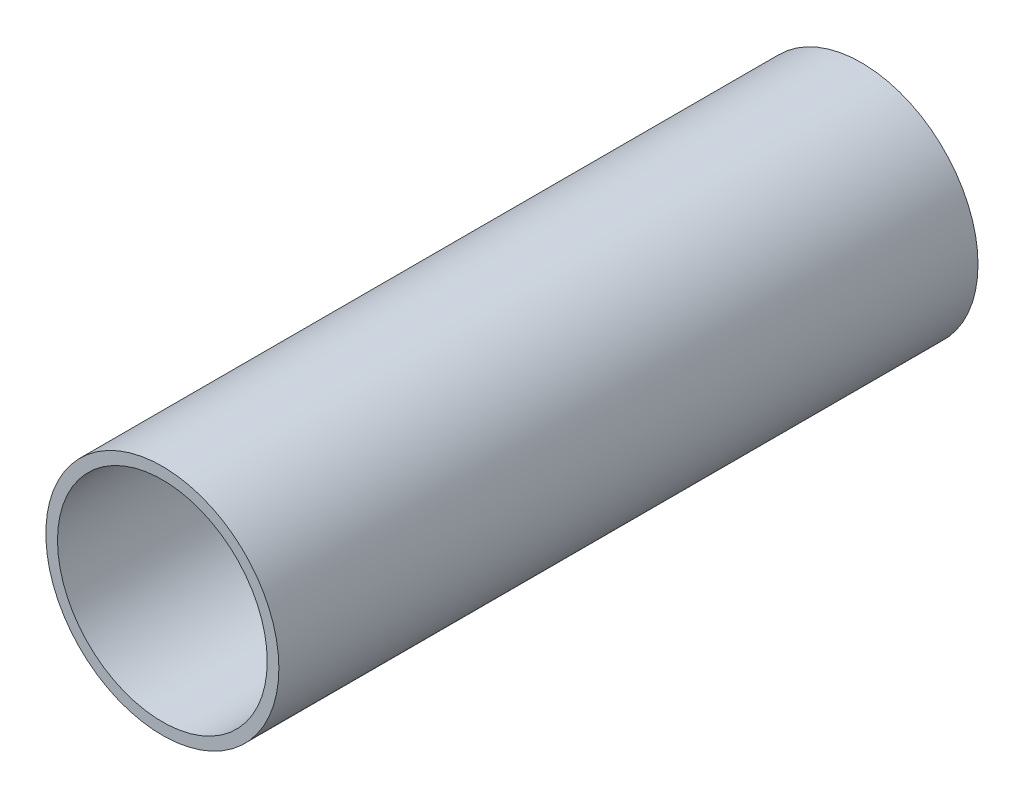
ISO-10303-21;
HEADER;
FILE_DESCRIPTION(('STEP AP214'),'2;1');
FILE_NAME('part.step','',(''),(''),'','','');
FILE_SCHEMA(('AUTOMOTIVE_DESIGN { 1 0 10303 214 1 1 1 1 }'));
ENDSEC;
DATA;
#1=APPLICATION_CONTEXT('core data for automotive mechanical design processes');
#2=APPLICATION_PROTOCOL_DEFINITION('international standard','automotive_design',2000,#1);
#3=PRODUCT_CONTEXT('',#1,'mechanical');
#4=PRODUCT('Part','Part','',(#3));
#5=PRODUCT_RELATED_PRODUCT_CATEGORY('part','',(#4));
#6=PRODUCT_DEFINITION_FORMATION('','',#4);
#7=PRODUCT_DEFINITION_CONTEXT('part definition',#1,'design');
#8=PRODUCT_DEFINITION('design','',#6,#7);
#9=PRODUCT_DEFINITION_SHAPE('','',#8);
#10=(LENGTH_UNIT() NAMED_UNIT(*) SI_UNIT(.MILLI.,.METRE.));
#11=(NAMED_UNIT(*) PLANE_ANGLE_UNIT() SI_UNIT($,.RADIAN.));
#12=(NAMED_UNIT(*) SI_UNIT($,.STERADIAN.) SOLID_ANGLE_UNIT());
#13=UNCERTAINTY_MEASURE_WITH_UNIT(LENGTH_MEASURE(1.E-05),#10,'distance_accuracy_value','');
#14=(GEOMETRIC_REPRESENTATION_CONTEXT(3) GLOBAL_UNCERTAINTY_ASSIGNED_CONTEXT((#13)) GLOBAL_UNIT_ASSIGNED_CONTEXT((#10,
#11,#12)) REPRESENTATION_CONTEXT('',''));
#15=CARTESIAN_POINT('',(0.,0.,0.));
#16=DIRECTION('',(0.,0.,1.));
#17=DIRECTION('',(1.,0.,0.));
#18=AXIS2_PLACEMENT_3D('',#15,#16,#17);
#19=CARTESIAN_POINT('',(0.,0.,60.));
#20=DIRECTION('',(0.,0.,1.));
#21=DIRECTION('',(1.,0.,0.));
#22=AXIS2_PLACEMENT_3D('',#19,#20,#21);
#23=PLANE('',#22);
#24=CARTESIAN_POINT('',(0.,0.,60.));
#25=DIRECTION('',(0.,0.,1.));
#26=DIRECTION('',(1.,0.,0.));
#27=AXIS2_PLACEMENT_3D('',#24,#25,#26);
#28=CIRCLE('',#27,10.);
#29=CARTESIAN_POINT('',(10.,0.,60.));
#30=VERTEX_POINT('',#29);
#31=EDGE_CURVE('E10',#30,#30,#28,.T.);
#32=ORIENTED_EDGE('',*,*,#31,.T.);
#33=EDGE_LOOP('',(#32));
#34=FACE_BOUND('',#33,.T.);
#35=CARTESIAN_POINT('',(0.,0.,60.));
#36=DIRECTION('',(0.,0.,1.));
#37=DIRECTION('',(1.,0.,0.));
#38=AXIS2_PLACEMENT_3D('',#35,#36,#37);
#39=CIRCLE('',#38,9.);
#40=CARTESIAN_POINT('',(9.,0.,60.));
#41=VERTEX_POINT('',#40);
#42=EDGE_CURVE('E52',#41,#41,#39,.T.);
#43=ORIENTED_EDGE('',*,*,#42,.F.);
#44=EDGE_LOOP('',(#43));
#45=FACE_BOUND('',#44,.T.);
#46=ADVANCED_FACE('F39',(#34,#45),#23,.T.);
#47=CARTESIAN_POINT('',(0.,0.,0.));
#48=DIRECTION('',(0.,0.,1.));
#49=DIRECTION('',(1.,0.,0.));
#50=AXIS2_PLACEMENT_3D('',#47,#48,#49);
#51=PLANE('',#50);
#52=CARTESIAN_POINT('',(0.,0.,0.));
#53=DIRECTION('',(0.,0.,1.));
#54=DIRECTION('',(1.,0.,0.));
#55=AXIS2_PLACEMENT_3D('',#52,#53,#54);
#56=CIRCLE('',#55,10.);
#57=CARTESIAN_POINT('',(10.,0.,0.));
#58=VERTEX_POINT('',#57);
#59=EDGE_CURVE('E43',#58,#58,#56,.T.);
#60=ORIENTED_EDGE('',*,*,#59,.F.);
#61=EDGE_LOOP('',(#60));
#62=FACE_BOUND('',#61,.T.);
#63=CARTESIAN_POINT('',(0.,0.,0.));
#64=DIRECTION('',(0.,0.,1.));
#65=DIRECTION('',(1.,0.,0.));
#66=AXIS2_PLACEMENT_3D('',#63,#64,#65);
#67=CIRCLE('',#66,9.);
#68=CARTESIAN_POINT('',(9.,0.,0.));
#69=VERTEX_POINT('',#68);
#70=EDGE_CURVE('E54',#69,#69,#67,.T.);
#71=ORIENTED_EDGE('',*,*,#70,.T.);
#72=EDGE_LOOP('',(#71));
#73=FACE_BOUND('',#72,.T.);
#74=ADVANCED_FACE('F66',(#62,#73),#51,.F.);
#75=CARTESIAN_POINT('',(0.,0.,60.));
#76=DIRECTION('',(0.,0.,-1.));
#77=DIRECTION('',(-1.,0.,0.));
#78=AXIS2_PLACEMENT_3D('',#75,#76,#77);
#79=CYLINDRICAL_SURFACE('',#78,10.);
#80=ORIENTED_EDGE('',*,*,#31,.F.);
#81=EDGE_LOOP('',(#80));
#82=FACE_BOUND('',#81,.T.);
#83=ORIENTED_EDGE('',*,*,#59,.T.);
#84=EDGE_LOOP('',(#83));
#85=FACE_BOUND('',#84,.T.);
#86=ADVANCED_FACE('F41',(#82,#85),#79,.T.);
#87=CARTESIAN_POINT('',(0.,0.,60.));
#88=DIRECTION('',(0.,0.,-1.));
#89=DIRECTION('',(-1.,0.,0.));
#90=AXIS2_PLACEMENT_3D('',#87,#88,#89);
#91=CYLINDRICAL_SURFACE('',#90,9.);
#92=ORIENTED_EDGE('',*,*,#42,.T.);
#93=EDGE_LOOP('',(#92));
#94=FACE_BOUND('',#93,.T.);
#95=ORIENTED_EDGE('',*,*,#70,.F.);
#96=EDGE_LOOP('',(#95));
#97=FACE_BOUND('',#96,.T.);
#98=ADVANCED_FACE('F62',(#94,#97),#91,.F.);
#99=CLOSED_SHELL('',(#46,#74,#86,#98));
#100=MANIFOLD_SOLID_BREP('B2',#99);
#101=ADVANCED_BREP_SHAPE_REPRESENTATION('',(#18,#100),#14);
#102=SHAPE_DEFINITION_REPRESENTATION(#9,#101);
ENDSEC;
END-ISO-10303-21;
